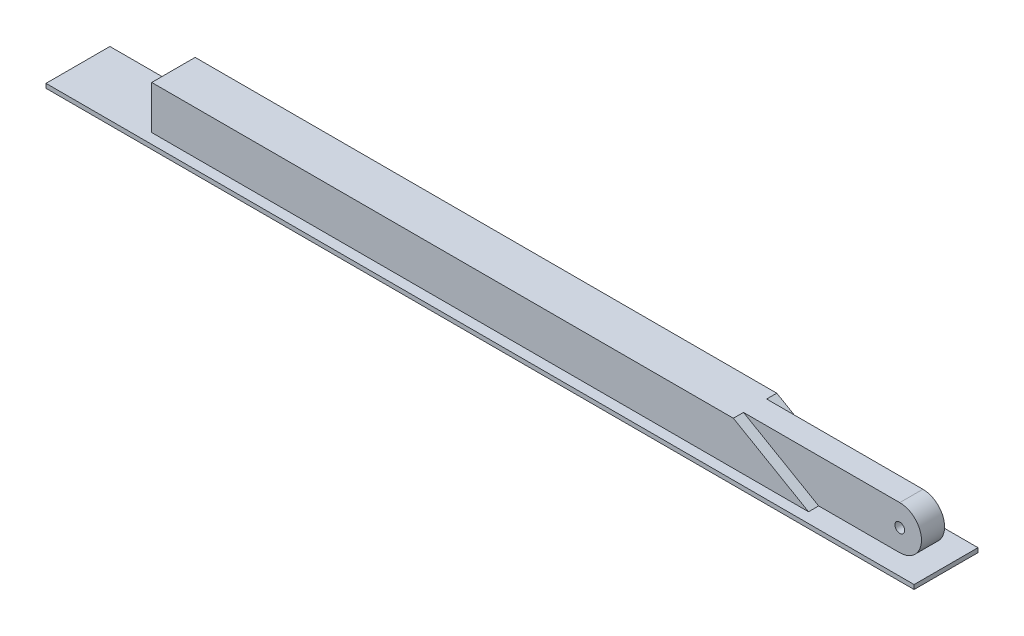
ISO-10303-21;
HEADER;
FILE_DESCRIPTION(('STEP AP214'),'2;1');
FILE_NAME('part.step','',(''),(''),'','','');
FILE_SCHEMA(('AUTOMOTIVE_DESIGN { 1 0 10303 214 1 1 1 1 }'));
ENDSEC;
DATA;
#1=APPLICATION_CONTEXT('core data for automotive mechanical design processes');
#2=APPLICATION_PROTOCOL_DEFINITION('international standard','automotive_design',2000,#1);
#3=PRODUCT_CONTEXT('',#1,'mechanical');
#4=PRODUCT('Part','Part','',(#3));
#5=PRODUCT_RELATED_PRODUCT_CATEGORY('part','',(#4));
#6=PRODUCT_DEFINITION_FORMATION('','',#4);
#7=PRODUCT_DEFINITION_CONTEXT('part definition',#1,'design');
#8=PRODUCT_DEFINITION('design','',#6,#7);
#9=PRODUCT_DEFINITION_SHAPE('','',#8);
#10=(LENGTH_UNIT() NAMED_UNIT(*) SI_UNIT(.MILLI.,.METRE.));
#11=(NAMED_UNIT(*) PLANE_ANGLE_UNIT() SI_UNIT($,.RADIAN.));
#12=(NAMED_UNIT(*) SI_UNIT($,.STERADIAN.) SOLID_ANGLE_UNIT());
#13=UNCERTAINTY_MEASURE_WITH_UNIT(LENGTH_MEASURE(1.E-05),#10,'distance_accuracy_value','');
#14=(GEOMETRIC_REPRESENTATION_CONTEXT(3) GLOBAL_UNCERTAINTY_ASSIGNED_CONTEXT((#13)) GLOBAL_UNIT_ASSIGNED_CONTEXT((#10,
#11,#12)) REPRESENTATION_CONTEXT('',''));
#15=CARTESIAN_POINT('',(0.,0.,0.));
#16=DIRECTION('',(0.,0.,1.));
#17=DIRECTION('',(1.,0.,0.));
#18=AXIS2_PLACEMENT_3D('',#15,#16,#17);
#19=CARTESIAN_POINT('',(225.,0.,15.));
#20=DIRECTION('',(0.,0.,-1.));
#21=DIRECTION('',(-1.,0.,0.));
#22=AXIS2_PLACEMENT_3D('',#19,#20,#21);
#23=CYLINDRICAL_SURFACE('',#22,15.);
#24=DIRECTION('',(0.,0.,-1.));
#25=VECTOR('',#24,1.);
#26=CARTESIAN_POINT('',(225.,-14.9999999999999,15.));
#27=LINE('',#26,#25);
#28=CARTESIAN_POINT('',(225.,-15.,8.));
#29=VERTEX_POINT('',#28);
#30=CARTESIAN_POINT('',(225.,-14.9999999999999,-8.));
#31=VERTEX_POINT('',#30);
#32=EDGE_CURVE('E165',#29,#31,#27,.T.);
#33=ORIENTED_EDGE('',*,*,#32,.T.);
#34=CARTESIAN_POINT('',(225.,0.,-8.));
#35=DIRECTION('',(0.,0.,1.));
#36=DIRECTION('',(1.,0.,0.));
#37=AXIS2_PLACEMENT_3D('',#34,#35,#36);
#38=CIRCLE('',#37,15.);
#39=CARTESIAN_POINT('',(225.,15.0000000000001,-8.));
#40=VERTEX_POINT('',#39);
#41=EDGE_CURVE('E159',#31,#40,#38,.T.);
#42=ORIENTED_EDGE('',*,*,#41,.T.);
#43=DIRECTION('',(0.,0.,-1.));
#44=VECTOR('',#43,1.);
#45=CARTESIAN_POINT('',(225.,15.0000000000001,15.));
#46=LINE('',#45,#44);
#47=CARTESIAN_POINT('',(225.,15.0000000000001,8.));
#48=VERTEX_POINT('',#47);
#49=EDGE_CURVE('E154',#48,#40,#46,.T.);
#50=ORIENTED_EDGE('',*,*,#49,.F.);
#51=CARTESIAN_POINT('',(225.,0.,8.));
#52=DIRECTION('',(0.,0.,-1.));
#53=DIRECTION('',(-1.,0.,0.));
#54=AXIS2_PLACEMENT_3D('',#51,#52,#53);
#55=CIRCLE('',#54,15.);
#56=EDGE_CURVE('E172',#48,#29,#55,.T.);
#57=ORIENTED_EDGE('',*,*,#56,.T.);
#58=EDGE_LOOP('',(#33,#42,#50,#57));
#59=FACE_BOUND('',#58,.T.);
#60=ADVANCED_FACE('F35',(#59),#23,.T.);
#61=CARTESIAN_POINT('',(-225.,15.,15.));
#62=DIRECTION('',(0.,-1.,0.));
#63=DIRECTION('',(1.,0.,0.));
#64=AXIS2_PLACEMENT_3D('',#61,#62,#63);
#65=PLANE('',#64);
#66=DIRECTION('',(1.,0.,0.));
#67=VECTOR('',#66,1.);
#68=CARTESIAN_POINT('',(217.,15.0000000000001,-8.));
#69=LINE('',#68,#67);
#70=CARTESIAN_POINT('',(117.,15.0000000000001,-8.));
#71=VERTEX_POINT('',#70);
#72=EDGE_CURVE('E191',#71,#40,#69,.T.);
#73=ORIENTED_EDGE('',*,*,#72,.F.);
#74=DIRECTION('',(0.,0.,-1.));
#75=VECTOR('',#74,1.);
#76=CARTESIAN_POINT('',(117.,15.0000000000001,14.9999999999991));
#77=LINE('',#76,#75);
#78=CARTESIAN_POINT('',(117.,15.0000000000001,-15.));
#79=VERTEX_POINT('',#78);
#80=EDGE_CURVE('E178',#71,#79,#77,.T.);
#81=ORIENTED_EDGE('',*,*,#80,.T.);
#82=DIRECTION('',(-1.,0.,0.));
#83=VECTOR('',#82,1.);
#84=CARTESIAN_POINT('',(-225.,15.,-15.));
#85=LINE('',#84,#83);
#86=CARTESIAN_POINT('',(-285.,15.,-15.));
#87=VERTEX_POINT('',#86);
#88=EDGE_CURVE('E152',#79,#87,#85,.T.);
#89=ORIENTED_EDGE('',*,*,#88,.T.);
#90=DIRECTION('',(0.,0.,-1.));
#91=VECTOR('',#90,1.);
#92=CARTESIAN_POINT('',(-285.,15.,-53.7915235297125));
#93=LINE('',#92,#91);
#94=CARTESIAN_POINT('',(-285.,15.,15.));
#95=VERTEX_POINT('',#94);
#96=EDGE_CURVE('E138',#95,#87,#93,.T.);
#97=ORIENTED_EDGE('',*,*,#96,.F.);
#98=DIRECTION('',(-1.,0.,0.));
#99=VECTOR('',#98,1.);
#100=CARTESIAN_POINT('',(-225.,15.,15.));
#101=LINE('',#100,#99);
#102=CARTESIAN_POINT('',(117.,15.0000000000001,15.));
#103=VERTEX_POINT('',#102);
#104=EDGE_CURVE('E146',#103,#95,#101,.T.);
#105=ORIENTED_EDGE('',*,*,#104,.F.);
#106=DIRECTION('',(0.,0.,-1.));
#107=VECTOR('',#106,1.);
#108=CARTESIAN_POINT('',(117.,15.0000000000001,15.0000000000005));
#109=LINE('',#108,#107);
#110=CARTESIAN_POINT('',(117.,15.0000000000001,8.));
#111=VERTEX_POINT('',#110);
#112=EDGE_CURVE('E168',#103,#111,#109,.T.);
#113=ORIENTED_EDGE('',*,*,#112,.T.);
#114=DIRECTION('',(-1.,0.,0.));
#115=VECTOR('',#114,1.);
#116=CARTESIAN_POINT('',(217.,15.0000000000001,8.));
#117=LINE('',#116,#115);
#118=EDGE_CURVE('E237',#48,#111,#117,.T.);
#119=ORIENTED_EDGE('',*,*,#118,.F.);
#120=ORIENTED_EDGE('',*,*,#49,.T.);
#121=EDGE_LOOP('',(#73,#81,#89,#97,#105,#113,#119,#120));
#122=FACE_BOUND('',#121,.T.);
#123=ADVANCED_FACE('F198',(#122),#65,.F.);
#124=CARTESIAN_POINT('',(-225.,0.,15.));
#125=DIRECTION('',(0.,0.,1.));
#126=DIRECTION('',(1.,0.,0.));
#127=AXIS2_PLACEMENT_3D('',#124,#125,#126);
#128=PLANE('',#127);
#129=DIRECTION('',(1.,0.,0.));
#130=VECTOR('',#129,1.);
#131=CARTESIAN_POINT('',(-225.,-15.,15.));
#132=LINE('',#131,#130);
#133=CARTESIAN_POINT('',(-285.,-15.,15.));
#134=VERTEX_POINT('',#133);
#135=CARTESIAN_POINT('',(168.961524227065,-14.9999999999999,15.));
#136=VERTEX_POINT('',#135);
#137=EDGE_CURVE('E143',#134,#136,#132,.T.);
#138=ORIENTED_EDGE('',*,*,#137,.T.);
#139=DIRECTION('',(0.866025403784435,-0.500000000000006,0.));
#140=VECTOR('',#139,1.);
#141=CARTESIAN_POINT('',(-133.004809471615,159.34034404714,15.));
#142=LINE('',#141,#140);
#143=EDGE_CURVE('E183',#136,#103,#142,.F.);
#144=ORIENTED_EDGE('',*,*,#143,.T.);
#145=ORIENTED_EDGE('',*,*,#104,.T.);
#146=DIRECTION('',(0.,1.,0.));
#147=VECTOR('',#146,1.);
#148=CARTESIAN_POINT('',(-285.,0.,15.));
#149=LINE('',#148,#147);
#150=EDGE_CURVE('E130',#134,#95,#149,.T.);
#151=ORIENTED_EDGE('',*,*,#150,.F.);
#152=EDGE_LOOP('',(#138,#144,#145,#151));
#153=FACE_BOUND('',#152,.T.);
#154=ADVANCED_FACE('F142',(#153),#128,.T.);
#155=CARTESIAN_POINT('',(-225.,0.,-15.));
#156=DIRECTION('',(0.,0.,1.));
#157=DIRECTION('',(1.,0.,0.));
#158=AXIS2_PLACEMENT_3D('',#155,#156,#157);
#159=PLANE('',#158);
#160=ORIENTED_EDGE('',*,*,#88,.F.);
#161=DIRECTION('',(-0.866025403784435,0.500000000000005,0.));
#162=VECTOR('',#161,1.);
#163=CARTESIAN_POINT('',(217.,-42.7350269189636,-15.));
#164=LINE('',#163,#162);
#165=CARTESIAN_POINT('',(168.961524227065,-14.9999999999999,-15.));
#166=VERTEX_POINT('',#165);
#167=EDGE_CURVE('E181',#79,#166,#164,.F.);
#168=ORIENTED_EDGE('',*,*,#167,.T.);
#169=DIRECTION('',(1.,0.,0.));
#170=VECTOR('',#169,1.);
#171=CARTESIAN_POINT('',(-225.,-15.,-15.));
#172=LINE('',#171,#170);
#173=CARTESIAN_POINT('',(-285.,-15.,-14.9999999999999));
#174=VERTEX_POINT('',#173);
#175=EDGE_CURVE('E156',#174,#166,#172,.T.);
#176=ORIENTED_EDGE('',*,*,#175,.F.);
#177=DIRECTION('',(0.,1.,0.));
#178=VECTOR('',#177,1.);
#179=CARTESIAN_POINT('',(-285.,0.,-15.));
#180=LINE('',#179,#178);
#181=EDGE_CURVE('E133',#174,#87,#180,.T.);
#182=ORIENTED_EDGE('',*,*,#181,.T.);
#183=EDGE_LOOP('',(#160,#168,#176,#182));
#184=FACE_BOUND('',#183,.T.);
#185=ADVANCED_FACE('F200',(#184),#159,.F.);
#186=CARTESIAN_POINT('',(217.,-15.,8.));
#187=DIRECTION('',(0.,0.,-1.));
#188=DIRECTION('',(-1.,0.,0.));
#189=AXIS2_PLACEMENT_3D('',#186,#187,#188);
#190=PLANE('',#189);
#191=CARTESIAN_POINT('',(225.,0.,8.));
#192=DIRECTION('',(0.,0.,-1.));
#193=DIRECTION('',(-1.,0.,0.));
#194=AXIS2_PLACEMENT_3D('',#191,#192,#193);
#195=CIRCLE('',#194,3.3782);
#196=CARTESIAN_POINT('',(221.6218,0.,8.));
#197=VERTEX_POINT('',#196);
#198=EDGE_CURVE('E169',#197,#197,#195,.F.);
#199=ORIENTED_EDGE('',*,*,#198,.F.);
#200=EDGE_LOOP('',(#199));
#201=FACE_BOUND('',#200,.T.);
#202=ORIENTED_EDGE('',*,*,#118,.T.);
#203=DIRECTION('',(-0.866025403784435,0.500000000000006,0.));
#204=VECTOR('',#203,1.);
#205=CARTESIAN_POINT('',(204.990381056766,-35.8012701892225,8.));
#206=LINE('',#205,#204);
#207=CARTESIAN_POINT('',(168.961524227065,-14.9999999999999,8.));
#208=VERTEX_POINT('',#207);
#209=EDGE_CURVE('E11',#111,#208,#206,.F.);
#210=ORIENTED_EDGE('',*,*,#209,.T.);
#211=DIRECTION('',(-1.,0.,0.));
#212=VECTOR('',#211,1.);
#213=CARTESIAN_POINT('',(217.,-15.,8.));
#214=LINE('',#213,#212);
#215=EDGE_CURVE('E51',#29,#208,#214,.T.);
#216=ORIENTED_EDGE('',*,*,#215,.F.);
#217=ORIENTED_EDGE('',*,*,#56,.F.);
#218=EDGE_LOOP('',(#202,#210,#216,#217));
#219=FACE_BOUND('',#218,.T.);
#220=ADVANCED_FACE('F246',(#201,#219),#190,.F.);
#221=CARTESIAN_POINT('',(217.,-15.,-8.));
#222=DIRECTION('',(0.,0.,1.));
#223=DIRECTION('',(1.,0.,0.));
#224=AXIS2_PLACEMENT_3D('',#221,#222,#223);
#225=PLANE('',#224);
#226=CARTESIAN_POINT('',(225.,0.,-8.));
#227=DIRECTION('',(0.,0.,1.));
#228=DIRECTION('',(1.,0.,0.));
#229=AXIS2_PLACEMENT_3D('',#226,#227,#228);
#230=CIRCLE('',#229,3.3782);
#231=CARTESIAN_POINT('',(228.3782,0.,-8.));
#232=VERTEX_POINT('',#231);
#233=EDGE_CURVE('E173',#232,#232,#230,.F.);
#234=ORIENTED_EDGE('',*,*,#233,.F.);
#235=EDGE_LOOP('',(#234));
#236=FACE_BOUND('',#235,.T.);
#237=DIRECTION('',(1.,0.,0.));
#238=VECTOR('',#237,1.);
#239=CARTESIAN_POINT('',(217.,-15.,-8.));
#240=LINE('',#239,#238);
#241=CARTESIAN_POINT('',(168.961524227065,-15.,-8.));
#242=VERTEX_POINT('',#241);
#243=EDGE_CURVE('E58',#242,#31,#240,.T.);
#244=ORIENTED_EDGE('',*,*,#243,.F.);
#245=DIRECTION('',(0.866025403784435,-0.500000000000005,0.));
#246=VECTOR('',#245,1.);
#247=CARTESIAN_POINT('',(204.990381056766,-35.8012701892225,-8.));
#248=LINE('',#247,#246);
#249=EDGE_CURVE('E187',#242,#71,#248,.F.);
#250=ORIENTED_EDGE('',*,*,#249,.T.);
#251=ORIENTED_EDGE('',*,*,#72,.T.);
#252=ORIENTED_EDGE('',*,*,#41,.F.);
#253=EDGE_LOOP('',(#244,#250,#251,#252));
#254=FACE_BOUND('',#253,.T.);
#255=ADVANCED_FACE('F190',(#236,#254),#225,.F.);
#256=CARTESIAN_POINT('',(225.,0.,15.));
#257=DIRECTION('',(0.,0.,1.));
#258=DIRECTION('',(1.,0.,0.));
#259=AXIS2_PLACEMENT_3D('',#256,#257,#258);
#260=CYLINDRICAL_SURFACE('',#259,3.3782);
#261=ORIENTED_EDGE('',*,*,#233,.T.);
#262=EDGE_LOOP('',(#261));
#263=FACE_BOUND('',#262,.T.);
#264=ORIENTED_EDGE('',*,*,#198,.T.);
#265=EDGE_LOOP('',(#264));
#266=FACE_BOUND('',#265,.T.);
#267=ADVANCED_FACE('F271',(#263,#266),#260,.F.);
#268=CARTESIAN_POINT('',(0.,-15.,0.));
#269=DIRECTION('',(0.,-1.,0.));
#270=DIRECTION('',(1.,0.,0.));
#271=AXIS2_PLACEMENT_3D('',#268,#269,#270);
#272=PLANE('',#271);
#273=ORIENTED_EDGE('',*,*,#137,.F.);
#274=DIRECTION('',(0.,0.,-1.));
#275=VECTOR('',#274,1.);
#276=CARTESIAN_POINT('',(-285.,-15.,-53.7915235297125));
#277=LINE('',#276,#275);
#278=EDGE_CURVE('E125',#134,#174,#277,.T.);
#279=ORIENTED_EDGE('',*,*,#278,.T.);
#280=ORIENTED_EDGE('',*,*,#175,.T.);
#281=DIRECTION('',(0.,0.,-1.));
#282=VECTOR('',#281,1.);
#283=CARTESIAN_POINT('',(168.961524227065,-14.9999999999999,-4.48422205115283E-13));
#284=LINE('',#283,#282);
#285=EDGE_CURVE('E185',#166,#242,#284,.F.);
#286=ORIENTED_EDGE('',*,*,#285,.T.);
#287=ORIENTED_EDGE('',*,*,#243,.T.);
#288=ORIENTED_EDGE('',*,*,#32,.F.);
#289=ORIENTED_EDGE('',*,*,#215,.T.);
#290=DIRECTION('',(0.,0.,-1.));
#291=VECTOR('',#290,1.);
#292=CARTESIAN_POINT('',(168.961524227065,-14.9999999999999,2.24211102557644E-13));
#293=LINE('',#292,#291);
#294=EDGE_CURVE('E44',#208,#136,#293,.F.);
#295=ORIENTED_EDGE('',*,*,#294,.T.);
#296=EDGE_LOOP('',(#273,#279,#280,#286,#287,#288,#289,#295));
#297=FACE_BOUND('',#296,.T.);
#298=DIRECTION('',(0.,0.,1.));
#299=VECTOR('',#298,1.);
#300=CARTESIAN_POINT('',(249.,-14.9999999999999,22.0794863015094));
#301=LINE('',#300,#299);
#302=CARTESIAN_POINT('',(249.,-14.9999999999999,-22.0794863015094));
#303=VERTEX_POINT('',#302);
#304=CARTESIAN_POINT('',(249.,-14.9999999999999,22.0794863015094));
#305=VERTEX_POINT('',#304);
#306=EDGE_CURVE('E147',#303,#305,#301,.T.);
#307=ORIENTED_EDGE('',*,*,#306,.F.);
#308=DIRECTION('',(1.,0.,0.));
#309=VECTOR('',#308,1.);
#310=CARTESIAN_POINT('',(-351.,-15.,-22.0794863015094));
#311=LINE('',#310,#309);
#312=CARTESIAN_POINT('',(-351.,-15.,-22.0794863015094));
#313=VERTEX_POINT('',#312);
#314=EDGE_CURVE('E209',#313,#303,#311,.T.);
#315=ORIENTED_EDGE('',*,*,#314,.F.);
#316=DIRECTION('',(0.,0.,-1.));
#317=VECTOR('',#316,1.);
#318=CARTESIAN_POINT('',(-351.,-15.,22.0794863015094));
#319=LINE('',#318,#317);
#320=CARTESIAN_POINT('',(-351.,-15.,22.0794863015094));
#321=VERTEX_POINT('',#320);
#322=EDGE_CURVE('E220',#321,#313,#319,.T.);
#323=ORIENTED_EDGE('',*,*,#322,.F.);
#324=DIRECTION('',(-1.,0.,0.));
#325=VECTOR('',#324,1.);
#326=CARTESIAN_POINT('',(-351.,-15.,22.0794863015094));
#327=LINE('',#326,#325);
#328=EDGE_CURVE('E218',#305,#321,#327,.T.);
#329=ORIENTED_EDGE('',*,*,#328,.F.);
#330=EDGE_LOOP('',(#307,#315,#323,#329));
#331=FACE_BOUND('',#330,.T.);
#332=ADVANCED_FACE('F149',(#297,#331),#272,.F.);
#333=CARTESIAN_POINT('',(249.,-17.9999999999999,22.0794863015094));
#334=DIRECTION('',(-1.,0.,0.));
#335=DIRECTION('',(0.,-1.,0.));
#336=AXIS2_PLACEMENT_3D('',#333,#334,#335);
#337=PLANE('',#336);
#338=ORIENTED_EDGE('',*,*,#306,.T.);
#339=DIRECTION('',(0.,1.,0.));
#340=VECTOR('',#339,1.);
#341=CARTESIAN_POINT('',(249.,-17.9999999999999,22.0794863015094));
#342=LINE('',#341,#340);
#343=CARTESIAN_POINT('',(249.,-17.9999999999999,22.0794863015094));
#344=VERTEX_POINT('',#343);
#345=EDGE_CURVE('E231',#344,#305,#342,.T.);
#346=ORIENTED_EDGE('',*,*,#345,.F.);
#347=DIRECTION('',(0.,0.,1.));
#348=VECTOR('',#347,1.);
#349=CARTESIAN_POINT('',(249.,-17.9999999999999,22.0794863015094));
#350=LINE('',#349,#348);
#351=CARTESIAN_POINT('',(249.,-17.9999999999999,-22.0794863015094));
#352=VERTEX_POINT('',#351);
#353=EDGE_CURVE('E205',#352,#344,#350,.T.);
#354=ORIENTED_EDGE('',*,*,#353,.F.);
#355=DIRECTION('',(0.,1.,0.));
#356=VECTOR('',#355,1.);
#357=CARTESIAN_POINT('',(249.,-17.9999999999999,-22.0794863015094));
#358=LINE('',#357,#356);
#359=EDGE_CURVE('E215',#352,#303,#358,.T.);
#360=ORIENTED_EDGE('',*,*,#359,.T.);
#361=EDGE_LOOP('',(#338,#346,#354,#360));
#362=FACE_BOUND('',#361,.T.);
#363=ADVANCED_FACE('F288',(#362),#337,.F.);
#364=CARTESIAN_POINT('',(-351.,-18.,22.0794863015094));
#365=DIRECTION('',(0.,0.,-1.));
#366=DIRECTION('',(-1.,0.,0.));
#367=AXIS2_PLACEMENT_3D('',#364,#365,#366);
#368=PLANE('',#367);
#369=ORIENTED_EDGE('',*,*,#328,.T.);
#370=DIRECTION('',(0.,1.,0.));
#371=VECTOR('',#370,1.);
#372=CARTESIAN_POINT('',(-351.,-18.,22.0794863015094));
#373=LINE('',#372,#371);
#374=CARTESIAN_POINT('',(-351.,-18.,22.0794863015094));
#375=VERTEX_POINT('',#374);
#376=EDGE_CURVE('E228',#375,#321,#373,.T.);
#377=ORIENTED_EDGE('',*,*,#376,.F.);
#378=DIRECTION('',(-1.,0.,0.));
#379=VECTOR('',#378,1.);
#380=CARTESIAN_POINT('',(-351.,-18.,22.0794863015094));
#381=LINE('',#380,#379);
#382=EDGE_CURVE('E208',#344,#375,#381,.T.);
#383=ORIENTED_EDGE('',*,*,#382,.F.);
#384=ORIENTED_EDGE('',*,*,#345,.T.);
#385=EDGE_LOOP('',(#369,#377,#383,#384));
#386=FACE_BOUND('',#385,.T.);
#387=ADVANCED_FACE('F291',(#386),#368,.F.);
#388=CARTESIAN_POINT('',(-351.,-18.,22.0794863015094));
#389=DIRECTION('',(1.,0.,0.));
#390=DIRECTION('',(0.,1.,0.));
#391=AXIS2_PLACEMENT_3D('',#388,#389,#390);
#392=PLANE('',#391);
#393=ORIENTED_EDGE('',*,*,#322,.T.);
#394=DIRECTION('',(0.,1.,0.));
#395=VECTOR('',#394,1.);
#396=CARTESIAN_POINT('',(-351.,-18.,-22.0794863015094));
#397=LINE('',#396,#395);
#398=CARTESIAN_POINT('',(-351.,-18.,-22.0794863015094));
#399=VERTEX_POINT('',#398);
#400=EDGE_CURVE('E225',#399,#313,#397,.T.);
#401=ORIENTED_EDGE('',*,*,#400,.F.);
#402=DIRECTION('',(0.,0.,-1.));
#403=VECTOR('',#402,1.);
#404=CARTESIAN_POINT('',(-351.,-18.,22.0794863015094));
#405=LINE('',#404,#403);
#406=EDGE_CURVE('E211',#375,#399,#405,.T.);
#407=ORIENTED_EDGE('',*,*,#406,.F.);
#408=ORIENTED_EDGE('',*,*,#376,.T.);
#409=EDGE_LOOP('',(#393,#401,#407,#408));
#410=FACE_BOUND('',#409,.T.);
#411=ADVANCED_FACE('F295',(#410),#392,.F.);
#412=CARTESIAN_POINT('',(-351.,-18.,-22.0794863015094));
#413=DIRECTION('',(0.,0.,1.));
#414=DIRECTION('',(1.,0.,0.));
#415=AXIS2_PLACEMENT_3D('',#412,#413,#414);
#416=PLANE('',#415);
#417=ORIENTED_EDGE('',*,*,#314,.T.);
#418=ORIENTED_EDGE('',*,*,#359,.F.);
#419=DIRECTION('',(1.,0.,0.));
#420=VECTOR('',#419,1.);
#421=CARTESIAN_POINT('',(-351.,-18.,-22.0794863015094));
#422=LINE('',#421,#420);
#423=EDGE_CURVE('E213',#399,#352,#422,.T.);
#424=ORIENTED_EDGE('',*,*,#423,.F.);
#425=ORIENTED_EDGE('',*,*,#400,.T.);
#426=EDGE_LOOP('',(#417,#418,#424,#425));
#427=FACE_BOUND('',#426,.T.);
#428=ADVANCED_FACE('F299',(#427),#416,.F.);
#429=CARTESIAN_POINT('',(0.,-18.,0.));
#430=DIRECTION('',(0.,-1.,0.));
#431=DIRECTION('',(1.,0.,0.));
#432=AXIS2_PLACEMENT_3D('',#429,#430,#431);
#433=PLANE('',#432);
#434=ORIENTED_EDGE('',*,*,#353,.T.);
#435=ORIENTED_EDGE('',*,*,#382,.T.);
#436=ORIENTED_EDGE('',*,*,#406,.T.);
#437=ORIENTED_EDGE('',*,*,#423,.T.);
#438=EDGE_LOOP('',(#434,#435,#436,#437));
#439=FACE_BOUND('',#438,.T.);
#440=ADVANCED_FACE('F303',(#439),#433,.T.);
#441=CARTESIAN_POINT('',(-285.,-172.842783667919,-53.7915235297125));
#442=DIRECTION('',(1.,0.,0.));
#443=DIRECTION('',(0.,1.,0.));
#444=AXIS2_PLACEMENT_3D('',#441,#442,#443);
#445=PLANE('',#444);
#446=ORIENTED_EDGE('',*,*,#150,.T.);
#447=ORIENTED_EDGE('',*,*,#96,.T.);
#448=ORIENTED_EDGE('',*,*,#181,.F.);
#449=ORIENTED_EDGE('',*,*,#278,.F.);
#450=EDGE_LOOP('',(#446,#447,#448,#449));
#451=FACE_BOUND('',#450,.T.);
#452=CARTESIAN_POINT('',(-285.,3.,0.));
#453=DIRECTION('',(1.,0.,0.));
#454=DIRECTION('',(0.,1.,0.));
#455=AXIS2_PLACEMENT_3D('',#452,#453,#454);
#456=CIRCLE('',#455,9.525);
#457=CARTESIAN_POINT('',(-285.,12.525,0.));
#458=VERTEX_POINT('',#457);
#459=EDGE_CURVE('E137',#458,#458,#456,.F.);
#460=ORIENTED_EDGE('',*,*,#459,.F.);
#461=EDGE_LOOP('',(#460));
#462=FACE_BOUND('',#461,.T.);
#463=ADVANCED_FACE('F127',(#451,#462),#445,.F.);
#464=CARTESIAN_POINT('',(67.0000000000001,3.,0.));
#465=DIRECTION('',(-1.,0.,0.));
#466=DIRECTION('',(0.,0.,1.));
#467=AXIS2_PLACEMENT_3D('',#464,#465,#466);
#468=PLANE('',#467);
#469=CARTESIAN_POINT('',(67.0000000000001,3.,0.));
#470=DIRECTION('',(-1.,0.,0.));
#471=DIRECTION('',(0.,0.,1.));
#472=AXIS2_PLACEMENT_3D('',#469,#470,#471);
#473=CIRCLE('',#472,9.525);
#474=CARTESIAN_POINT('',(67.0000000000001,3.,9.525));
#475=VERTEX_POINT('',#474);
#476=EDGE_CURVE('E234',#475,#475,#473,.T.);
#477=ORIENTED_EDGE('',*,*,#476,.T.);
#478=EDGE_LOOP('',(#477));
#479=FACE_BOUND('',#478,.T.);
#480=ADVANCED_FACE('F283',(#479),#468,.T.);
#481=CARTESIAN_POINT('',(67.0000000000001,3.,0.));
#482=DIRECTION('',(-1.,0.,0.));
#483=DIRECTION('',(0.,0.,1.));
#484=AXIS2_PLACEMENT_3D('',#481,#482,#483);
#485=CYLINDRICAL_SURFACE('',#484,9.525);
#486=ORIENTED_EDGE('',*,*,#459,.T.);
#487=EDGE_LOOP('',(#486));
#488=FACE_BOUND('',#487,.T.);
#489=ORIENTED_EDGE('',*,*,#476,.F.);
#490=EDGE_LOOP('',(#489));
#491=FACE_BOUND('',#490,.T.);
#492=ADVANCED_FACE('F254',(#488,#491),#485,.F.);
#493=CARTESIAN_POINT('',(217.,-42.7350269189636,-28.9161112376698));
#494=DIRECTION('',(-0.500000000000005,-0.866025403784435,0.));
#495=DIRECTION('',(0.,0.,1.));
#496=AXIS2_PLACEMENT_3D('',#493,#494,#495);
#497=PLANE('',#496);
#498=ORIENTED_EDGE('',*,*,#167,.F.);
#499=ORIENTED_EDGE('',*,*,#80,.F.);
#500=ORIENTED_EDGE('',*,*,#249,.F.);
#501=ORIENTED_EDGE('',*,*,#285,.F.);
#502=EDGE_LOOP('',(#498,#499,#500,#501));
#503=FACE_BOUND('',#502,.T.);
#504=ADVANCED_FACE('F195',(#503),#497,.F.);
#505=CARTESIAN_POINT('',(217.,-42.7350269189636,28.9161112376696));
#506=DIRECTION('',(-0.500000000000006,-0.866025403784435,0.));
#507=DIRECTION('',(0.,0.,1.));
#508=AXIS2_PLACEMENT_3D('',#505,#506,#507);
#509=PLANE('',#508);
#510=ORIENTED_EDGE('',*,*,#209,.F.);
#511=ORIENTED_EDGE('',*,*,#112,.F.);
#512=ORIENTED_EDGE('',*,*,#143,.F.);
#513=ORIENTED_EDGE('',*,*,#294,.F.);
#514=EDGE_LOOP('',(#510,#511,#512,#513));
#515=FACE_BOUND('',#514,.T.);
#516=ADVANCED_FACE('F38',(#515),#509,.F.);
#517=CLOSED_SHELL('',(#60,#123,#154,#185,#220,#255,#267,#332,#363,#387,#411,#428,#440,#463,#480,
#492,#504,#516));
#518=MANIFOLD_SOLID_BREP('B2',#517);
#519=ADVANCED_BREP_SHAPE_REPRESENTATION('',(#18,#518),#14);
#520=SHAPE_DEFINITION_REPRESENTATION(#9,#519);
ENDSEC;
END-ISO-10303-21;
